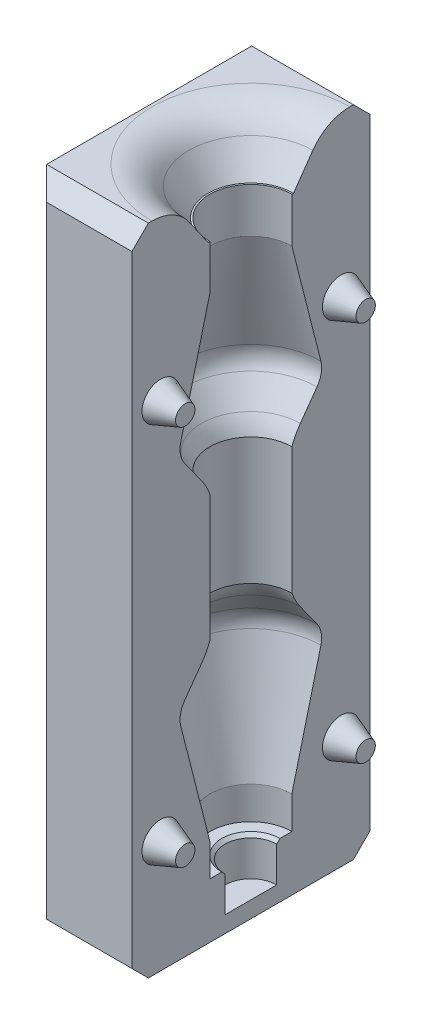
ISO-10303-21;
HEADER;
FILE_DESCRIPTION(('STEP AP214'),'2;1');
FILE_NAME('part.step','',(''),(''),'','','');
FILE_SCHEMA(('AUTOMOTIVE_DESIGN { 1 0 10303 214 1 1 1 1 }'));
ENDSEC;
DATA;
#1=APPLICATION_CONTEXT('core data for automotive mechanical design processes');
#2=APPLICATION_PROTOCOL_DEFINITION('international standard','automotive_design',2000,#1);
#3=PRODUCT_CONTEXT('',#1,'mechanical');
#4=PRODUCT('Part','Part','',(#3));
#5=PRODUCT_RELATED_PRODUCT_CATEGORY('part','',(#4));
#6=PRODUCT_DEFINITION_FORMATION('','',#4);
#7=PRODUCT_DEFINITION_CONTEXT('part definition',#1,'design');
#8=PRODUCT_DEFINITION('design','',#6,#7);
#9=PRODUCT_DEFINITION_SHAPE('','',#8);
#10=(LENGTH_UNIT() NAMED_UNIT(*) SI_UNIT(.MILLI.,.METRE.));
#11=(NAMED_UNIT(*) PLANE_ANGLE_UNIT() SI_UNIT($,.RADIAN.));
#12=(NAMED_UNIT(*) SI_UNIT($,.STERADIAN.) SOLID_ANGLE_UNIT());
#13=UNCERTAINTY_MEASURE_WITH_UNIT(LENGTH_MEASURE(1.E-05),#10,'distance_accuracy_value','');
#14=(GEOMETRIC_REPRESENTATION_CONTEXT(3) GLOBAL_UNCERTAINTY_ASSIGNED_CONTEXT((#13)) GLOBAL_UNIT_ASSIGNED_CONTEXT((#10,
#11,#12)) REPRESENTATION_CONTEXT('',''));
#15=CARTESIAN_POINT('',(0.,0.,0.));
#16=DIRECTION('',(0.,0.,1.));
#17=DIRECTION('',(1.,0.,0.));
#18=AXIS2_PLACEMENT_3D('',#15,#16,#17);
#19=CARTESIAN_POINT('',(15.,0.,0.));
#20=DIRECTION('',(-1.,0.,0.));
#21=DIRECTION('',(0.,0.,1.));
#22=AXIS2_PLACEMENT_3D('',#19,#20,#21);
#23=PLANE('',#22);
#24=CARTESIAN_POINT('',(15.,64.5,-4.));
#25=DIRECTION('',(-1.,0.,0.));
#26=DIRECTION('',(0.,0.,1.));
#27=AXIS2_PLACEMENT_3D('',#24,#25,#26);
#28=CIRCLE('',#27,2.275);
#29=CARTESIAN_POINT('',(15.,64.5,-1.725));
#30=VERTEX_POINT('',#29);
#31=EDGE_CURVE('E379',#30,#30,#28,.F.);
#32=ORIENTED_EDGE('',*,*,#31,.F.);
#33=EDGE_LOOP('',(#32));
#34=FACE_BOUND('',#33,.T.);
#35=CARTESIAN_POINT('',(15.,18.,-4.));
#36=DIRECTION('',(-1.,0.,0.));
#37=DIRECTION('',(0.,0.,1.));
#38=AXIS2_PLACEMENT_3D('',#35,#36,#37);
#39=CIRCLE('',#38,2.275);
#40=CARTESIAN_POINT('',(15.,18.,-1.725));
#41=VERTEX_POINT('',#40);
#42=EDGE_CURVE('E376',#41,#41,#39,.F.);
#43=ORIENTED_EDGE('',*,*,#42,.F.);
#44=EDGE_LOOP('',(#43));
#45=FACE_BOUND('',#44,.T.);
#46=CARTESIAN_POINT('',(15.,18.,-26.));
#47=DIRECTION('',(-1.,0.,0.));
#48=DIRECTION('',(0.,0.,1.));
#49=AXIS2_PLACEMENT_3D('',#46,#47,#48);
#50=CIRCLE('',#49,2.275);
#51=CARTESIAN_POINT('',(15.,18.,-23.725));
#52=VERTEX_POINT('',#51);
#53=EDGE_CURVE('E373',#52,#52,#50,.F.);
#54=ORIENTED_EDGE('',*,*,#53,.F.);
#55=EDGE_LOOP('',(#54));
#56=FACE_BOUND('',#55,.T.);
#57=CARTESIAN_POINT('',(15.,64.5,-26.));
#58=DIRECTION('',(-1.,0.,0.));
#59=DIRECTION('',(0.,0.,1.));
#60=AXIS2_PLACEMENT_3D('',#57,#58,#59);
#61=CIRCLE('',#60,2.275);
#62=CARTESIAN_POINT('',(15.,64.5,-23.725));
#63=VERTEX_POINT('',#62);
#64=EDGE_CURVE('E299',#63,#63,#61,.F.);
#65=ORIENTED_EDGE('',*,*,#64,.F.);
#66=EDGE_LOOP('',(#65));
#67=FACE_BOUND('',#66,.T.);
#68=DIRECTION('',(0.,0.,-1.));
#69=VECTOR('',#68,1.);
#70=CARTESIAN_POINT('',(15.,84.,0.));
#71=LINE('',#70,#69);
#72=CARTESIAN_POINT('',(15.,84.,-2.49999999999999));
#73=VERTEX_POINT('',#72);
#74=CARTESIAN_POINT('',(14.9999999999994,84.,-2.93688122196542));
#75=VERTEX_POINT('',#74);
#76=EDGE_CURVE('E301',#73,#75,#71,.T.);
#77=ORIENTED_EDGE('',*,*,#76,.F.);
#78=DIRECTION('',(0.,-0.707106781186544,0.707106781186551));
#79=VECTOR('',#78,1.);
#80=CARTESIAN_POINT('',(15.,84.,-2.49999999999999));
#81=LINE('',#80,#79);
#82=CARTESIAN_POINT('',(15.,82.,-0.5));
#83=VERTEX_POINT('',#82);
#84=EDGE_CURVE('E393',#73,#83,#81,.T.);
#85=ORIENTED_EDGE('',*,*,#84,.T.);
#86=DIRECTION('',(0.,1.,0.));
#87=VECTOR('',#86,1.);
#88=CARTESIAN_POINT('',(15.,0.,-0.5));
#89=LINE('',#88,#87);
#90=CARTESIAN_POINT('',(15.,6.28575422534891,-0.5));
#91=VERTEX_POINT('',#90);
#92=EDGE_CURVE('E248',#91,#83,#89,.T.);
#93=ORIENTED_EDGE('',*,*,#92,.F.);
#94=DIRECTION('',(0.,0.707106781186544,0.707106781186551));
#95=VECTOR('',#94,1.);
#96=CARTESIAN_POINT('',(15.,6.28575422534891,-0.5));
#97=LINE('',#96,#95);
#98=CARTESIAN_POINT('',(15.,4.28575422534894,-2.5));
#99=VERTEX_POINT('',#98);
#100=EDGE_CURVE('E391',#91,#99,#97,.F.);
#101=ORIENTED_EDGE('',*,*,#100,.T.);
#102=DIRECTION('',(0.,0.,-1.));
#103=VECTOR('',#102,1.);
#104=CARTESIAN_POINT('',(15.,4.28575422534894,0.));
#105=LINE('',#104,#103);
#106=CARTESIAN_POINT('',(15.,4.28575422534894,-27.5));
#107=VERTEX_POINT('',#106);
#108=EDGE_CURVE('E296',#99,#107,#105,.T.);
#109=ORIENTED_EDGE('',*,*,#108,.T.);
#110=DIRECTION('',(0.,0.707106781186544,-0.707106781186551));
#111=VECTOR('',#110,1.);
#112=CARTESIAN_POINT('',(15.,4.28575422534894,-27.5));
#113=LINE('',#112,#111);
#114=CARTESIAN_POINT('',(15.,6.28575422534891,-29.5));
#115=VERTEX_POINT('',#114);
#116=EDGE_CURVE('E389',#107,#115,#113,.T.);
#117=ORIENTED_EDGE('',*,*,#116,.T.);
#118=DIRECTION('',(0.,1.,0.));
#119=VECTOR('',#118,1.);
#120=CARTESIAN_POINT('',(15.,0.,-29.5));
#121=LINE('',#120,#119);
#122=CARTESIAN_POINT('',(15.,82.,-29.5));
#123=VERTEX_POINT('',#122);
#124=EDGE_CURVE('E242',#115,#123,#121,.T.);
#125=ORIENTED_EDGE('',*,*,#124,.T.);
#126=DIRECTION('',(0.,-0.707106781186544,-0.707106781186551));
#127=VECTOR('',#126,1.);
#128=CARTESIAN_POINT('',(15.,82.,-29.5));
#129=LINE('',#128,#127);
#130=CARTESIAN_POINT('',(15.,84.,-27.5));
#131=VERTEX_POINT('',#130);
#132=EDGE_CURVE('E387',#123,#131,#129,.F.);
#133=ORIENTED_EDGE('',*,*,#132,.T.);
#134=CARTESIAN_POINT('',(14.9999999999994,84.,-27.0631187780346));
#135=VERTEX_POINT('',#134);
#136=EDGE_CURVE('E304',#135,#131,#71,.T.);
#137=ORIENTED_EDGE('',*,*,#136,.F.);
#138=CARTESIAN_POINT('',(14.9999999999994,78.5,-27.0631187780346));
#139=DIRECTION('',(-1.,0.,0.));
#140=DIRECTION('',(0.,0.,1.));
#141=AXIS2_PLACEMENT_3D('',#138,#139,#140);
#142=CIRCLE('',#141,5.5);
#143=CARTESIAN_POINT('',(14.9999999999994,81.6546703999308,-22.5577825344452));
#144=VERTEX_POINT('',#143);
#145=EDGE_CURVE('E307',#135,#144,#142,.F.);
#146=ORIENTED_EDGE('',*,*,#145,.T.);
#147=DIRECTION('',(0.,-0.819152044288991,0.573576436351047));
#148=VECTOR('',#147,1.);
#149=CARTESIAN_POINT('',(15.,70.8610383379726,-15.));
#150=LINE('',#149,#148);
#151=CARTESIAN_POINT('',(15.,78.3,-20.2088170322047));
#152=VERTEX_POINT('',#151);
#153=EDGE_CURVE('E230',#152,#144,#150,.F.);
#154=ORIENTED_EDGE('',*,*,#153,.F.);
#155=DIRECTION('',(0.,0.,1.));
#156=VECTOR('',#155,1.);
#157=CARTESIAN_POINT('',(14.9999999999994,78.3,-15.));
#158=LINE('',#157,#156);
#159=CARTESIAN_POINT('',(14.9999999999994,78.3,-20.));
#160=VERTEX_POINT('',#159);
#161=EDGE_CURVE('E317',#152,#160,#158,.T.);
#162=ORIENTED_EDGE('',*,*,#161,.T.);
#163=DIRECTION('',(0.,1.,0.));
#164=VECTOR('',#163,1.);
#165=CARTESIAN_POINT('',(15.,0.,-20.));
#166=LINE('',#165,#164);
#167=CARTESIAN_POINT('',(15.,72.8279687630189,-20.));
#168=VERTEX_POINT('',#167);
#169=EDGE_CURVE('E318',#168,#160,#166,.T.);
#170=ORIENTED_EDGE('',*,*,#169,.F.);
#171=DIRECTION('',(0.,-0.969140628666556,-0.246508502627785));
#172=VECTOR('',#171,1.);
#173=CARTESIAN_POINT('',(15.,92.4853156361592,-15.));
#174=LINE('',#173,#172);
#175=CARTESIAN_POINT('',(15.,58.9056790871227,-23.5412433238688));
#176=VERTEX_POINT('',#175);
#177=EDGE_CURVE('E325',#176,#168,#174,.F.);
#178=ORIENTED_EDGE('',*,*,#177,.F.);
#179=CARTESIAN_POINT('',(15.,58.1661535792394,-20.6338214378691));
#180=DIRECTION('',(-1.,0.,0.));
#181=DIRECTION('',(0.,0.,1.));
#182=AXIS2_PLACEMENT_3D('',#179,#180,#181);
#183=CIRCLE('',#182,3.);
#184=CARTESIAN_POINT('',(15.,56.4142970331814,-23.06918560818));
#185=VERTEX_POINT('',#184);
#186=EDGE_CURVE('E329',#185,#176,#183,.F.);
#187=ORIENTED_EDGE('',*,*,#186,.F.);
#188=DIRECTION('',(0.,-0.811788056770281,0.583952182019325));
#189=VECTOR('',#188,1.);
#190=CARTESIAN_POINT('',(15.,45.1968228867001,-15.));
#191=LINE('',#190,#189);
#192=CARTESIAN_POINT('',(15.,53.5848299933968,-21.0338348315159));
#193=VERTEX_POINT('',#192);
#194=EDGE_CURVE('E333',#193,#185,#191,.F.);
#195=ORIENTED_EDGE('',*,*,#194,.F.);
#196=CARTESIAN_POINT('',(15.,48.8259067213079,-27.6495085019331));
#197=DIRECTION('',(-1.,0.,0.));
#198=DIRECTION('',(0.,0.,1.));
#199=AXIS2_PLACEMENT_3D('',#196,#197,#198);
#200=CIRCLE('',#199,8.1495085019331);
#201=CARTESIAN_POINT('',(15.,51.6365131508767,-20.));
#202=VERTEX_POINT('',#201);
#203=EDGE_CURVE('E341',#193,#202,#200,.F.);
#204=ORIENTED_EDGE('',*,*,#203,.T.);
#205=DIRECTION('',(0.,1.,0.));
#206=VECTOR('',#205,1.);
#207=CARTESIAN_POINT('',(15.,0.,-20.));
#208=LINE('',#207,#206);
#209=CARTESIAN_POINT('',(15.,36.1674950601248,-20.));
#210=VERTEX_POINT('',#209);
#211=EDGE_CURVE('E328',#210,#202,#208,.T.);
#212=ORIENTED_EDGE('',*,*,#211,.F.);
#213=CARTESIAN_POINT('',(15.,38.9781014896936,-27.6495085019331));
#214=DIRECTION('',(-1.,0.,0.));
#215=DIRECTION('',(0.,0.,1.));
#216=AXIS2_PLACEMENT_3D('',#213,#214,#215);
#217=CIRCLE('',#216,8.1495085019331);
#218=CARTESIAN_POINT('',(15.,34.2191782176047,-21.0338348315159));
#219=VERTEX_POINT('',#218);
#220=EDGE_CURVE('E344',#210,#219,#217,.F.);
#221=ORIENTED_EDGE('',*,*,#220,.T.);
#222=DIRECTION('',(0.,-0.811788056770281,-0.583952182019325));
#223=VECTOR('',#222,1.);
#224=CARTESIAN_POINT('',(15.,42.6071853243014,-15.));
#225=LINE('',#224,#223);
#226=CARTESIAN_POINT('',(15.,31.3897111778201,-23.06918560818));
#227=VERTEX_POINT('',#226);
#228=EDGE_CURVE('E354',#227,#219,#225,.F.);
#229=ORIENTED_EDGE('',*,*,#228,.F.);
#230=CARTESIAN_POINT('',(15.,29.6378546317621,-20.6338214378691));
#231=DIRECTION('',(-1.,0.,0.));
#232=DIRECTION('',(0.,0.,1.));
#233=AXIS2_PLACEMENT_3D('',#230,#231,#232);
#234=CIRCLE('',#233,3.);
#235=CARTESIAN_POINT('',(15.,28.8983291238788,-23.5412433238688));
#236=VERTEX_POINT('',#235);
#237=EDGE_CURVE('E359',#236,#227,#234,.F.);
#238=ORIENTED_EDGE('',*,*,#237,.F.);
#239=DIRECTION('',(0.,-0.969140628666556,0.246508502627785));
#240=VECTOR('',#239,1.);
#241=CARTESIAN_POINT('',(15.,-4.6813074251577,-15.));
#242=LINE('',#241,#240);
#243=CARTESIAN_POINT('',(15.,14.9760394479826,-20.));
#244=VERTEX_POINT('',#243);
#245=EDGE_CURVE('E356',#244,#236,#242,.F.);
#246=ORIENTED_EDGE('',*,*,#245,.F.);
#247=DIRECTION('',(0.,1.,0.));
#248=VECTOR('',#247,1.);
#249=CARTESIAN_POINT('',(15.,0.,-20.));
#250=LINE('',#249,#248);
#251=CARTESIAN_POINT('',(15.,11.,-20.));
#252=VERTEX_POINT('',#251);
#253=EDGE_CURVE('E303',#252,#244,#250,.T.);
#254=ORIENTED_EDGE('',*,*,#253,.F.);
#255=DIRECTION('',(0.,0.,-1.));
#256=VECTOR('',#255,1.);
#257=CARTESIAN_POINT('',(15.,11.,-15.));
#258=LINE('',#257,#256);
#259=CARTESIAN_POINT('',(15.,11.,-18.55));
#260=VERTEX_POINT('',#259);
#261=EDGE_CURVE('E314',#260,#252,#258,.T.);
#262=ORIENTED_EDGE('',*,*,#261,.F.);
#263=DIRECTION('',(0.,-0.707106781186544,0.707106781186551));
#264=VECTOR('',#263,1.);
#265=CARTESIAN_POINT('',(15.,7.45000000000003,-15.));
#266=LINE('',#265,#264);
#267=CARTESIAN_POINT('',(15.,10.6,-18.15));
#268=VERTEX_POINT('',#267);
#269=EDGE_CURVE('E367',#260,#268,#266,.T.);
#270=ORIENTED_EDGE('',*,*,#269,.T.);
#271=DIRECTION('',(0.,-1.,0.));
#272=VECTOR('',#271,1.);
#273=CARTESIAN_POINT('',(15.,11.,-18.15));
#274=LINE('',#273,#272);
#275=CARTESIAN_POINT('',(15.,6.28575422534894,-18.15));
#276=VERTEX_POINT('',#275);
#277=EDGE_CURVE('E226',#276,#268,#274,.F.);
#278=ORIENTED_EDGE('',*,*,#277,.F.);
#279=DIRECTION('',(0.,0.,-1.));
#280=VECTOR('',#279,1.);
#281=CARTESIAN_POINT('',(15.,6.28575422534894,0.));
#282=LINE('',#281,#280);
#283=CARTESIAN_POINT('',(15.,6.28575422534894,-11.85));
#284=VERTEX_POINT('',#283);
#285=EDGE_CURVE('E219',#284,#276,#282,.T.);
#286=ORIENTED_EDGE('',*,*,#285,.F.);
#287=DIRECTION('',(0.,-1.,0.));
#288=VECTOR('',#287,1.);
#289=CARTESIAN_POINT('',(15.,11.,-11.85));
#290=LINE('',#289,#288);
#291=CARTESIAN_POINT('',(15.,10.6,-11.85));
#292=VERTEX_POINT('',#291);
#293=EDGE_CURVE('E223',#292,#284,#290,.T.);
#294=ORIENTED_EDGE('',*,*,#293,.F.);
#295=DIRECTION('',(0.,0.707106781186544,0.707106781186551));
#296=VECTOR('',#295,1.);
#297=CARTESIAN_POINT('',(15.,7.45000000000003,-15.));
#298=LINE('',#297,#296);
#299=CARTESIAN_POINT('',(15.,11.,-11.45));
#300=VERTEX_POINT('',#299);
#301=EDGE_CURVE('E340',#292,#300,#298,.T.);
#302=ORIENTED_EDGE('',*,*,#301,.T.);
#303=CARTESIAN_POINT('',(15.,11.,-10.));
#304=VERTEX_POINT('',#303);
#305=EDGE_CURVE('E335',#304,#300,#258,.T.);
#306=ORIENTED_EDGE('',*,*,#305,.F.);
#307=DIRECTION('',(0.,1.,0.));
#308=VECTOR('',#307,1.);
#309=CARTESIAN_POINT('',(15.,0.,-10.));
#310=LINE('',#309,#308);
#311=CARTESIAN_POINT('',(15.,14.9760394479826,-10.));
#312=VERTEX_POINT('',#311);
#313=EDGE_CURVE('E238',#312,#304,#310,.F.);
#314=ORIENTED_EDGE('',*,*,#313,.F.);
#315=DIRECTION('',(0.,0.969140628666556,0.246508502627785));
#316=VECTOR('',#315,1.);
#317=CARTESIAN_POINT('',(15.,-4.6813074251577,-15.));
#318=LINE('',#317,#316);
#319=CARTESIAN_POINT('',(15.,28.8983291238788,-6.45875667613122));
#320=VERTEX_POINT('',#319);
#321=EDGE_CURVE('E360',#320,#312,#318,.F.);
#322=ORIENTED_EDGE('',*,*,#321,.F.);
#323=CARTESIAN_POINT('',(15.,29.6378546317621,-9.36617856213088));
#324=DIRECTION('',(-1.,0.,0.));
#325=DIRECTION('',(0.,0.,1.));
#326=AXIS2_PLACEMENT_3D('',#323,#324,#325);
#327=CIRCLE('',#326,3.);
#328=CARTESIAN_POINT('',(15.,31.3897111778201,-6.93081439182004));
#329=VERTEX_POINT('',#328);
#330=EDGE_CURVE('E357',#329,#320,#327,.F.);
#331=ORIENTED_EDGE('',*,*,#330,.F.);
#332=DIRECTION('',(0.,0.811788056770281,-0.583952182019325));
#333=VECTOR('',#332,1.);
#334=CARTESIAN_POINT('',(15.,42.6071853243014,-15.));
#335=LINE('',#334,#333);
#336=CARTESIAN_POINT('',(15.,34.2191782176047,-8.96616516848405));
#337=VERTEX_POINT('',#336);
#338=EDGE_CURVE('E348',#337,#329,#335,.F.);
#339=ORIENTED_EDGE('',*,*,#338,.F.);
#340=CARTESIAN_POINT('',(15.,38.9781014896936,-2.3504914980669));
#341=DIRECTION('',(-1.,0.,0.));
#342=DIRECTION('',(0.,0.,1.));
#343=AXIS2_PLACEMENT_3D('',#340,#341,#342);
#344=CIRCLE('',#343,8.1495085019331);
#345=CARTESIAN_POINT('',(15.,36.1674950601248,-10.));
#346=VERTEX_POINT('',#345);
#347=EDGE_CURVE('E322',#337,#346,#344,.F.);
#348=ORIENTED_EDGE('',*,*,#347,.T.);
#349=DIRECTION('',(0.,1.,0.));
#350=VECTOR('',#349,1.);
#351=CARTESIAN_POINT('',(15.,0.,-10.));
#352=LINE('',#351,#350);
#353=CARTESIAN_POINT('',(15.,51.6365131508767,-10.));
#354=VERTEX_POINT('',#353);
#355=EDGE_CURVE('E346',#354,#346,#352,.F.);
#356=ORIENTED_EDGE('',*,*,#355,.F.);
#357=CARTESIAN_POINT('',(15.,48.8259067213079,-2.3504914980669));
#358=DIRECTION('',(-1.,0.,0.));
#359=DIRECTION('',(0.,0.,1.));
#360=AXIS2_PLACEMENT_3D('',#357,#358,#359);
#361=CIRCLE('',#360,8.1495085019331);
#362=CARTESIAN_POINT('',(15.,53.5848299933968,-8.96616516848405));
#363=VERTEX_POINT('',#362);
#364=EDGE_CURVE('E337',#354,#363,#361,.F.);
#365=ORIENTED_EDGE('',*,*,#364,.T.);
#366=DIRECTION('',(0.,0.811788056770281,0.583952182019325));
#367=VECTOR('',#366,1.);
#368=CARTESIAN_POINT('',(15.,45.1968228867001,-15.));
#369=LINE('',#368,#367);
#370=CARTESIAN_POINT('',(15.,56.4142970331814,-6.93081439182004));
#371=VERTEX_POINT('',#370);
#372=EDGE_CURVE('E331',#371,#363,#369,.F.);
#373=ORIENTED_EDGE('',*,*,#372,.F.);
#374=CARTESIAN_POINT('',(15.,58.1661535792394,-9.36617856213088));
#375=DIRECTION('',(-1.,0.,0.));
#376=DIRECTION('',(0.,0.,1.));
#377=AXIS2_PLACEMENT_3D('',#374,#375,#376);
#378=CIRCLE('',#377,3.);
#379=CARTESIAN_POINT('',(15.,58.9056790871227,-6.45875667613122));
#380=VERTEX_POINT('',#379);
#381=EDGE_CURVE('E326',#380,#371,#378,.F.);
#382=ORIENTED_EDGE('',*,*,#381,.F.);
#383=DIRECTION('',(0.,0.969140628666556,-0.246508502627785));
#384=VECTOR('',#383,1.);
#385=CARTESIAN_POINT('',(15.,92.4853156361592,-15.));
#386=LINE('',#385,#384);
#387=CARTESIAN_POINT('',(15.,72.8279687630189,-10.));
#388=VERTEX_POINT('',#387);
#389=EDGE_CURVE('E323',#388,#380,#386,.F.);
#390=ORIENTED_EDGE('',*,*,#389,.F.);
#391=DIRECTION('',(0.,1.,0.));
#392=VECTOR('',#391,1.);
#393=CARTESIAN_POINT('',(15.,0.,-10.));
#394=LINE('',#393,#392);
#395=CARTESIAN_POINT('',(14.9999999999994,78.3,-10.));
#396=VERTEX_POINT('',#395);
#397=EDGE_CURVE('E320',#396,#388,#394,.F.);
#398=ORIENTED_EDGE('',*,*,#397,.F.);
#399=CARTESIAN_POINT('',(14.9999999999994,78.3,-9.79118296779536));
#400=VERTEX_POINT('',#399);
#401=EDGE_CURVE('E310',#396,#400,#158,.T.);
#402=ORIENTED_EDGE('',*,*,#401,.T.);
#403=DIRECTION('',(0.,0.819152044288991,0.573576436351047));
#404=VECTOR('',#403,1.);
#405=CARTESIAN_POINT('',(15.,70.8610383379726,-15.));
#406=LINE('',#405,#404);
#407=CARTESIAN_POINT('',(14.9999999999994,81.6546703999308,-7.44221746555486));
#408=VERTEX_POINT('',#407);
#409=EDGE_CURVE('E312',#408,#400,#406,.F.);
#410=ORIENTED_EDGE('',*,*,#409,.F.);
#411=CARTESIAN_POINT('',(14.9999999999994,78.5,-2.93688122196542));
#412=DIRECTION('',(-1.,0.,0.));
#413=DIRECTION('',(0.,0.,1.));
#414=AXIS2_PLACEMENT_3D('',#411,#412,#413);
#415=CIRCLE('',#414,5.5);
#416=EDGE_CURVE('E300',#408,#75,#415,.F.);
#417=ORIENTED_EDGE('',*,*,#416,.T.);
#418=EDGE_LOOP('',(#77,#85,#93,#101,#109,#117,#125,#133,#137,#146,#154,#162,#170,#178,#187,#195,
#204,#212,#221,#229,#238,#246,#254,#262,#270,#278,#286,#294,#302,#306,#314,#322,#331,#339,#348,
#356,#365,#373,#382,#390,#398,#402,#410,#417));
#419=FACE_BOUND('',#418,.T.);
#420=ADVANCED_FACE('F41',(#34,#45,#56,#67,#419),#23,.F.);
#421=CARTESIAN_POINT('',(15.,0.,-15.));
#422=DIRECTION('',(0.,1.,0.));
#423=DIRECTION('',(0.,0.,1.));
#424=AXIS2_PLACEMENT_3D('',#421,#422,#423);
#425=CYLINDRICAL_SURFACE('',#424,5.);
#426=CARTESIAN_POINT('',(15.,78.3,-15.));
#427=DIRECTION('',(0.,1.,0.));
#428=DIRECTION('',(0.,0.,1.));
#429=AXIS2_PLACEMENT_3D('',#426,#427,#428);
#430=CIRCLE('',#429,5.);
#431=EDGE_CURVE('E245',#396,#160,#430,.F.);
#432=ORIENTED_EDGE('',*,*,#431,.F.);
#433=ORIENTED_EDGE('',*,*,#397,.T.);
#434=CARTESIAN_POINT('',(15.,72.8279687630189,-15.));
#435=DIRECTION('',(0.,-1.,0.));
#436=DIRECTION('',(0.,0.,-1.));
#437=AXIS2_PLACEMENT_3D('',#434,#435,#436);
#438=CIRCLE('',#437,5.);
#439=EDGE_CURVE('E276',#388,#168,#438,.T.);
#440=ORIENTED_EDGE('',*,*,#439,.T.);
#441=ORIENTED_EDGE('',*,*,#169,.T.);
#442=EDGE_LOOP('',(#432,#433,#440,#441));
#443=FACE_BOUND('',#442,.T.);
#444=ADVANCED_FACE('F518',(#443),#425,.F.);
#445=CARTESIAN_POINT('',(15.,11.,-15.));
#446=DIRECTION('',(0.,-1.,0.));
#447=DIRECTION('',(0.,0.,-1.));
#448=AXIS2_PLACEMENT_3D('',#445,#446,#447);
#449=CYLINDRICAL_SURFACE('',#448,3.15);
#450=CARTESIAN_POINT('',(15.,6.28575422534894,-15.));
#451=DIRECTION('',(0.,1.,0.));
#452=DIRECTION('',(0.,0.,1.));
#453=AXIS2_PLACEMENT_3D('',#450,#451,#452);
#454=CIRCLE('',#453,3.15);
#455=EDGE_CURVE('E235',#284,#276,#454,.F.);
#456=ORIENTED_EDGE('',*,*,#455,.T.);
#457=ORIENTED_EDGE('',*,*,#277,.T.);
#458=CARTESIAN_POINT('',(15.,10.6,-15.));
#459=DIRECTION('',(0.,-1.,0.));
#460=DIRECTION('',(0.,0.,-1.));
#461=AXIS2_PLACEMENT_3D('',#458,#459,#460);
#462=CIRCLE('',#461,3.15);
#463=EDGE_CURVE('E237',#268,#292,#462,.F.);
#464=ORIENTED_EDGE('',*,*,#463,.T.);
#465=ORIENTED_EDGE('',*,*,#293,.T.);
#466=EDGE_LOOP('',(#456,#457,#464,#465));
#467=FACE_BOUND('',#466,.T.);
#468=ADVANCED_FACE('F234',(#467),#449,.F.);
#469=CARTESIAN_POINT('',(15.,14.9760394479826,-15.));
#470=DIRECTION('',(0.,1.,0.));
#471=DIRECTION('',(0.,0.,1.));
#472=AXIS2_PLACEMENT_3D('',#469,#470,#471);
#473=CIRCLE('',#472,5.);
#474=EDGE_CURVE('E270',#244,#312,#473,.T.);
#475=ORIENTED_EDGE('',*,*,#474,.T.);
#476=ORIENTED_EDGE('',*,*,#313,.T.);
#477=CARTESIAN_POINT('',(15.,11.,-15.));
#478=DIRECTION('',(0.,-1.,0.));
#479=DIRECTION('',(0.,0.,-1.));
#480=AXIS2_PLACEMENT_3D('',#477,#478,#479);
#481=CIRCLE('',#480,5.);
#482=EDGE_CURVE('E282',#252,#304,#481,.F.);
#483=ORIENTED_EDGE('',*,*,#482,.F.);
#484=ORIENTED_EDGE('',*,*,#253,.T.);
#485=EDGE_LOOP('',(#475,#476,#483,#484));
#486=FACE_BOUND('',#485,.T.);
#487=ADVANCED_FACE('F566',(#486),#425,.F.);
#488=CARTESIAN_POINT('',(0.,84.,0.));
#489=DIRECTION('',(0.,-1.,0.));
#490=DIRECTION('',(0.,0.,-1.));
#491=AXIS2_PLACEMENT_3D('',#488,#489,#490);
#492=PLANE('',#491);
#493=DIRECTION('',(0.,0.,1.));
#494=VECTOR('',#493,1.);
#495=CARTESIAN_POINT('',(2.6,84.,0.));
#496=LINE('',#495,#494);
#497=CARTESIAN_POINT('',(2.6,84.,-27.5));
#498=VERTEX_POINT('',#497);
#499=CARTESIAN_POINT('',(2.6,84.,-2.49999999999997));
#500=VERTEX_POINT('',#499);
#501=EDGE_CURVE('E457',#498,#500,#496,.T.);
#502=ORIENTED_EDGE('',*,*,#501,.T.);
#503=DIRECTION('',(1.,0.,0.));
#504=VECTOR('',#503,1.);
#505=CARTESIAN_POINT('',(15.,84.,-2.49999999999999));
#506=LINE('',#505,#504);
#507=EDGE_CURVE('E384',#500,#73,#506,.T.);
#508=ORIENTED_EDGE('',*,*,#507,.T.);
#509=ORIENTED_EDGE('',*,*,#76,.T.);
#510=CARTESIAN_POINT('',(14.9999999999994,84.,-15.));
#511=DIRECTION('',(0.,-1.,0.));
#512=DIRECTION('',(0.,0.,-1.));
#513=AXIS2_PLACEMENT_3D('',#510,#511,#512);
#514=CIRCLE('',#513,12.0631187780346);
#515=EDGE_CURVE('E231',#75,#135,#514,.T.);
#516=ORIENTED_EDGE('',*,*,#515,.T.);
#517=ORIENTED_EDGE('',*,*,#136,.T.);
#518=DIRECTION('',(-1.,0.,0.));
#519=VECTOR('',#518,1.);
#520=CARTESIAN_POINT('',(0.,84.,-27.5));
#521=LINE('',#520,#519);
#522=EDGE_CURVE('E382',#131,#498,#521,.T.);
#523=ORIENTED_EDGE('',*,*,#522,.T.);
#524=EDGE_LOOP('',(#502,#508,#509,#516,#517,#523));
#525=FACE_BOUND('',#524,.T.);
#526=ADVANCED_FACE('F500',(#525),#492,.F.);
#527=CARTESIAN_POINT('',(15.,29.6378546317621,-15.));
#528=DIRECTION('',(0.,-1.,0.));
#529=DIRECTION('',(0.,0.,1.));
#530=AXIS2_PLACEMENT_3D('',#527,#528,#529);
#531=TOROIDAL_SURFACE('',#530,5.63382143786911,3.);
#532=CARTESIAN_POINT('',(15.,28.8983291238788,-15.));
#533=DIRECTION('',(0.,1.,0.));
#534=DIRECTION('',(0.,0.,1.));
#535=AXIS2_PLACEMENT_3D('',#532,#533,#534);
#536=CIRCLE('',#535,8.54124332386878);
#537=EDGE_CURVE('E255',#236,#320,#536,.T.);
#538=ORIENTED_EDGE('',*,*,#537,.F.);
#539=ORIENTED_EDGE('',*,*,#237,.T.);
#540=CARTESIAN_POINT('',(15.,31.3897111778201,-15.));
#541=DIRECTION('',(0.,-1.,0.));
#542=DIRECTION('',(0.,0.,-1.));
#543=AXIS2_PLACEMENT_3D('',#540,#541,#542);
#544=CIRCLE('',#543,8.06918560817996);
#545=EDGE_CURVE('E252',#329,#227,#544,.T.);
#546=ORIENTED_EDGE('',*,*,#545,.F.);
#547=ORIENTED_EDGE('',*,*,#330,.T.);
#548=EDGE_LOOP('',(#538,#539,#546,#547));
#549=FACE_BOUND('',#548,.T.);
#550=ADVANCED_FACE('F556',(#549),#531,.F.);
#551=CARTESIAN_POINT('',(15.,34.4020041055008,-15.));
#552=DIRECTION('',(0.,1.,0.));
#553=DIRECTION('',(0.,0.,-1.));
#554=AXIS2_PLACEMENT_3D('',#551,#552,#553);
#555=CONICAL_SURFACE('',#554,9.94114612284268,0.249075921515313);
#556=ORIENTED_EDGE('',*,*,#537,.T.);
#557=ORIENTED_EDGE('',*,*,#321,.T.);
#558=ORIENTED_EDGE('',*,*,#474,.F.);
#559=ORIENTED_EDGE('',*,*,#245,.T.);
#560=EDGE_LOOP('',(#556,#557,#558,#559));
#561=FACE_BOUND('',#560,.T.);
#562=ADVANCED_FACE('F559',(#561),#555,.F.);
#563=CARTESIAN_POINT('',(15.,34.4020041055008,-15.));
#564=DIRECTION('',(0.,-1.,0.));
#565=DIRECTION('',(0.,0.,1.));
#566=AXIS2_PLACEMENT_3D('',#563,#564,#565);
#567=CONICAL_SURFACE('',#566,5.90232073091279,0.623588704481849);
#568=ORIENTED_EDGE('',*,*,#545,.T.);
#569=ORIENTED_EDGE('',*,*,#228,.T.);
#570=CARTESIAN_POINT('',(15.,34.2191782176047,-15.));
#571=DIRECTION('',(0.,-1.,0.));
#572=DIRECTION('',(0.,0.,-1.));
#573=AXIS2_PLACEMENT_3D('',#570,#571,#572);
#574=CIRCLE('',#573,6.03383483151595);
#575=EDGE_CURVE('E258',#219,#337,#574,.F.);
#576=ORIENTED_EDGE('',*,*,#575,.T.);
#577=ORIENTED_EDGE('',*,*,#338,.T.);
#578=EDGE_LOOP('',(#568,#569,#576,#577));
#579=FACE_BOUND('',#578,.T.);
#580=ADVANCED_FACE('F553',(#579),#567,.F.);
#581=CARTESIAN_POINT('',(15.,38.9781014896936,-15.));
#582=DIRECTION('',(0.,1.,0.));
#583=DIRECTION('',(0.,0.,-1.));
#584=AXIS2_PLACEMENT_3D('',#581,#582,#583);
#585=TOROIDAL_SURFACE('',#584,12.6495085019331,8.1495085019331);
#586=ORIENTED_EDGE('',*,*,#347,.F.);
#587=ORIENTED_EDGE('',*,*,#575,.F.);
#588=ORIENTED_EDGE('',*,*,#220,.F.);
#589=CARTESIAN_POINT('',(15.,36.1674950601248,-15.));
#590=DIRECTION('',(0.,1.,0.));
#591=DIRECTION('',(0.,0.,1.));
#592=AXIS2_PLACEMENT_3D('',#589,#590,#591);
#593=CIRCLE('',#592,5.);
#594=EDGE_CURVE('E273',#210,#346,#593,.T.);
#595=ORIENTED_EDGE('',*,*,#594,.T.);
#596=EDGE_LOOP('',(#586,#587,#588,#595));
#597=FACE_BOUND('',#596,.T.);
#598=ADVANCED_FACE('F544',(#597),#585,.T.);
#599=CARTESIAN_POINT('',(15.,51.6365131508767,-15.));
#600=DIRECTION('',(0.,-1.,0.));
#601=DIRECTION('',(0.,0.,-1.));
#602=AXIS2_PLACEMENT_3D('',#599,#600,#601);
#603=CIRCLE('',#602,5.);
#604=EDGE_CURVE('E279',#354,#202,#603,.T.);
#605=ORIENTED_EDGE('',*,*,#604,.F.);
#606=ORIENTED_EDGE('',*,*,#355,.T.);
#607=ORIENTED_EDGE('',*,*,#594,.F.);
#608=ORIENTED_EDGE('',*,*,#211,.T.);
#609=EDGE_LOOP('',(#605,#606,#607,#608));
#610=FACE_BOUND('',#609,.T.);
#611=ADVANCED_FACE('F542',(#610),#425,.F.);
#612=CARTESIAN_POINT('',(15.,48.8259067213079,-15.));
#613=DIRECTION('',(0.,-1.,0.));
#614=DIRECTION('',(0.,0.,-1.));
#615=AXIS2_PLACEMENT_3D('',#612,#613,#614);
#616=TOROIDAL_SURFACE('',#615,12.6495085019331,8.1495085019331);
#617=ORIENTED_EDGE('',*,*,#203,.F.);
#618=CARTESIAN_POINT('',(15.,53.5848299933968,-15.));
#619=DIRECTION('',(0.,-1.,0.));
#620=DIRECTION('',(0.,0.,-1.));
#621=AXIS2_PLACEMENT_3D('',#618,#619,#620);
#622=CIRCLE('',#621,6.03383483151595);
#623=EDGE_CURVE('E267',#193,#363,#622,.F.);
#624=ORIENTED_EDGE('',*,*,#623,.T.);
#625=ORIENTED_EDGE('',*,*,#364,.F.);
#626=ORIENTED_EDGE('',*,*,#604,.T.);
#627=EDGE_LOOP('',(#617,#624,#625,#626));
#628=FACE_BOUND('',#627,.T.);
#629=ADVANCED_FACE('F539',(#628),#616,.T.);
#630=CARTESIAN_POINT('',(15.,53.4020041055008,-15.));
#631=DIRECTION('',(0.,-1.,0.));
#632=DIRECTION('',(0.,0.,-1.));
#633=AXIS2_PLACEMENT_3D('',#630,#631,#632);
#634=CONICAL_SURFACE('',#633,9.94114612284268,0.249075921515313);
#635=CARTESIAN_POINT('',(15.,58.9056790871227,-15.));
#636=DIRECTION('',(0.,1.,0.));
#637=DIRECTION('',(0.,0.,1.));
#638=AXIS2_PLACEMENT_3D('',#635,#636,#637);
#639=CIRCLE('',#638,8.54124332386878);
#640=EDGE_CURVE('E264',#176,#380,#639,.T.);
#641=ORIENTED_EDGE('',*,*,#640,.F.);
#642=ORIENTED_EDGE('',*,*,#177,.T.);
#643=ORIENTED_EDGE('',*,*,#439,.F.);
#644=ORIENTED_EDGE('',*,*,#389,.T.);
#645=EDGE_LOOP('',(#641,#642,#643,#644));
#646=FACE_BOUND('',#645,.T.);
#647=ADVANCED_FACE('F526',(#646),#634,.F.);
#648=CARTESIAN_POINT('',(15.,58.1661535792394,-15.));
#649=DIRECTION('',(0.,1.,0.));
#650=DIRECTION('',(0.,0.,1.));
#651=AXIS2_PLACEMENT_3D('',#648,#649,#650);
#652=TOROIDAL_SURFACE('',#651,5.63382143786911,3.);
#653=ORIENTED_EDGE('',*,*,#640,.T.);
#654=ORIENTED_EDGE('',*,*,#381,.T.);
#655=CARTESIAN_POINT('',(15.,56.4142970331814,-15.));
#656=DIRECTION('',(0.,-1.,0.));
#657=DIRECTION('',(0.,0.,-1.));
#658=AXIS2_PLACEMENT_3D('',#655,#656,#657);
#659=CIRCLE('',#658,8.06918560817996);
#660=EDGE_CURVE('E261',#371,#185,#659,.T.);
#661=ORIENTED_EDGE('',*,*,#660,.T.);
#662=ORIENTED_EDGE('',*,*,#186,.T.);
#663=EDGE_LOOP('',(#653,#654,#661,#662));
#664=FACE_BOUND('',#663,.T.);
#665=ADVANCED_FACE('F529',(#664),#652,.F.);
#666=CARTESIAN_POINT('',(15.,53.4020041055008,-15.));
#667=DIRECTION('',(0.,1.,0.));
#668=DIRECTION('',(0.,0.,1.));
#669=AXIS2_PLACEMENT_3D('',#666,#667,#668);
#670=CONICAL_SURFACE('',#669,5.90232073091279,0.623588704481849);
#671=ORIENTED_EDGE('',*,*,#660,.F.);
#672=ORIENTED_EDGE('',*,*,#372,.T.);
#673=ORIENTED_EDGE('',*,*,#623,.F.);
#674=ORIENTED_EDGE('',*,*,#194,.T.);
#675=EDGE_LOOP('',(#671,#672,#673,#674));
#676=FACE_BOUND('',#675,.T.);
#677=ADVANCED_FACE('F533',(#676),#670,.F.);
#678=CARTESIAN_POINT('',(15.,11.,-15.));
#679=DIRECTION('',(0.,-1.,0.));
#680=DIRECTION('',(0.,0.,-1.));
#681=AXIS2_PLACEMENT_3D('',#678,#679,#680);
#682=PLANE('',#681);
#683=ORIENTED_EDGE('',*,*,#482,.T.);
#684=ORIENTED_EDGE('',*,*,#305,.T.);
#685=CARTESIAN_POINT('',(15.,11.,-15.));
#686=DIRECTION('',(0.,-1.,0.));
#687=DIRECTION('',(0.,0.,-1.));
#688=AXIS2_PLACEMENT_3D('',#685,#686,#687);
#689=CIRCLE('',#688,3.55000000000001);
#690=EDGE_CURVE('E286',#300,#260,#689,.T.);
#691=ORIENTED_EDGE('',*,*,#690,.T.);
#692=ORIENTED_EDGE('',*,*,#261,.T.);
#693=EDGE_LOOP('',(#683,#684,#691,#692));
#694=FACE_BOUND('',#693,.T.);
#695=ADVANCED_FACE('F569',(#694),#682,.F.);
#696=CARTESIAN_POINT('',(15.,11.,-15.));
#697=DIRECTION('',(0.,1.,0.));
#698=DIRECTION('',(0.,0.,1.));
#699=AXIS2_PLACEMENT_3D('',#696,#697,#698);
#700=CONICAL_SURFACE('',#699,3.55000000000001,0.785398163397454);
#701=ORIENTED_EDGE('',*,*,#301,.F.);
#702=ORIENTED_EDGE('',*,*,#463,.F.);
#703=ORIENTED_EDGE('',*,*,#269,.F.);
#704=ORIENTED_EDGE('',*,*,#690,.F.);
#705=EDGE_LOOP('',(#701,#702,#703,#704));
#706=FACE_BOUND('',#705,.T.);
#707=ADVANCED_FACE('F572',(#706),#700,.F.);
#708=CARTESIAN_POINT('',(14.9999999999994,78.3,-15.));
#709=DIRECTION('',(0.,1.,0.));
#710=DIRECTION('',(0.,0.,1.));
#711=AXIS2_PLACEMENT_3D('',#708,#709,#710);
#712=PLANE('',#711);
#713=ORIENTED_EDGE('',*,*,#161,.F.);
#714=CARTESIAN_POINT('',(14.9999999999994,78.3,-15.));
#715=DIRECTION('',(0.,1.,0.));
#716=DIRECTION('',(0.,0.,1.));
#717=AXIS2_PLACEMENT_3D('',#714,#715,#716);
#718=CIRCLE('',#717,5.20881703220465);
#719=EDGE_CURVE('E241',#152,#400,#718,.T.);
#720=ORIENTED_EDGE('',*,*,#719,.T.);
#721=ORIENTED_EDGE('',*,*,#401,.F.);
#722=ORIENTED_EDGE('',*,*,#431,.T.);
#723=EDGE_LOOP('',(#713,#720,#721,#722));
#724=FACE_BOUND('',#723,.T.);
#725=ADVANCED_FACE('F514',(#724),#712,.T.);
#726=CARTESIAN_POINT('',(14.9999999999994,84.,-15.));
#727=DIRECTION('',(0.,1.,0.));
#728=DIRECTION('',(0.,0.,1.));
#729=AXIS2_PLACEMENT_3D('',#726,#727,#728);
#730=CONICAL_SURFACE('',#729,9.2,0.610865238198017);
#731=CARTESIAN_POINT('',(14.9999999999994,81.6546703999308,-15.));
#732=DIRECTION('',(0.,-1.,0.));
#733=DIRECTION('',(0.,0.,-1.));
#734=AXIS2_PLACEMENT_3D('',#731,#732,#733);
#735=CIRCLE('',#734,7.55778253444515);
#736=EDGE_CURVE('E289',#144,#408,#735,.F.);
#737=ORIENTED_EDGE('',*,*,#736,.T.);
#738=ORIENTED_EDGE('',*,*,#409,.T.);
#739=ORIENTED_EDGE('',*,*,#719,.F.);
#740=ORIENTED_EDGE('',*,*,#153,.T.);
#741=EDGE_LOOP('',(#737,#738,#739,#740));
#742=FACE_BOUND('',#741,.T.);
#743=ADVANCED_FACE('F512',(#742),#730,.F.);
#744=CARTESIAN_POINT('',(14.9999999999994,78.5,-15.));
#745=DIRECTION('',(0.,-1.,0.));
#746=DIRECTION('',(0.,0.,-1.));
#747=AXIS2_PLACEMENT_3D('',#744,#745,#746);
#748=TOROIDAL_SURFACE('',#747,12.0631187780346,5.5);
#749=ORIENTED_EDGE('',*,*,#145,.F.);
#750=ORIENTED_EDGE('',*,*,#515,.F.);
#751=ORIENTED_EDGE('',*,*,#416,.F.);
#752=ORIENTED_EDGE('',*,*,#736,.F.);
#753=EDGE_LOOP('',(#749,#750,#751,#752));
#754=FACE_BOUND('',#753,.T.);
#755=ADVANCED_FACE('F504',(#754),#748,.T.);
#756=CARTESIAN_POINT('',(0.,6.28575422534894,0.));
#757=DIRECTION('',(0.,-1.,0.));
#758=DIRECTION('',(0.,0.,-1.));
#759=AXIS2_PLACEMENT_3D('',#756,#757,#758);
#760=PLANE('',#759);
#761=ORIENTED_EDGE('',*,*,#455,.F.);
#762=ORIENTED_EDGE('',*,*,#285,.T.);
#763=EDGE_LOOP('',(#761,#762));
#764=FACE_BOUND('',#763,.T.);
#765=ADVANCED_FACE('F240',(#764),#760,.F.);
#766=CARTESIAN_POINT('',(0.,4.28575422534894,0.));
#767=DIRECTION('',(0.,-1.,0.));
#768=DIRECTION('',(0.,0.,-1.));
#769=AXIS2_PLACEMENT_3D('',#766,#767,#768);
#770=PLANE('',#769);
#771=ORIENTED_EDGE('',*,*,#108,.F.);
#772=DIRECTION('',(-1.,0.,0.));
#773=VECTOR('',#772,1.);
#774=CARTESIAN_POINT('',(0.,4.28575422534894,-2.5));
#775=LINE('',#774,#773);
#776=CARTESIAN_POINT('',(4.6,4.28575422534894,-2.5));
#777=VERTEX_POINT('',#776);
#778=EDGE_CURVE('E411',#99,#777,#775,.T.);
#779=ORIENTED_EDGE('',*,*,#778,.T.);
#780=DIRECTION('',(0.,0.,-1.));
#781=VECTOR('',#780,1.);
#782=CARTESIAN_POINT('',(4.6,4.28575422534894,0.));
#783=LINE('',#782,#781);
#784=CARTESIAN_POINT('',(4.59999999999999,4.28575422534894,-27.5));
#785=VERTEX_POINT('',#784);
#786=EDGE_CURVE('E409',#777,#785,#783,.T.);
#787=ORIENTED_EDGE('',*,*,#786,.T.);
#788=DIRECTION('',(1.,0.,0.));
#789=VECTOR('',#788,1.);
#790=CARTESIAN_POINT('',(15.,4.28575422534894,-27.5));
#791=LINE('',#790,#789);
#792=EDGE_CURVE('E407',#785,#107,#791,.T.);
#793=ORIENTED_EDGE('',*,*,#792,.T.);
#794=EDGE_LOOP('',(#771,#779,#787,#793));
#795=FACE_BOUND('',#794,.T.);
#796=ADVANCED_FACE('F489',(#795),#770,.T.);
#797=CARTESIAN_POINT('',(0.,4.28575422534894,-29.5));
#798=DIRECTION('',(0.,0.,1.));
#799=DIRECTION('',(1.,0.,0.));
#800=AXIS2_PLACEMENT_3D('',#797,#798,#799);
#801=PLANE('',#800);
#802=ORIENTED_EDGE('',*,*,#124,.F.);
#803=DIRECTION('',(-1.,0.,0.));
#804=VECTOR('',#803,1.);
#805=CARTESIAN_POINT('',(2.6,6.28575422534891,-29.5));
#806=LINE('',#805,#804);
#807=CARTESIAN_POINT('',(4.59999999999997,6.28575422534891,-29.5));
#808=VERTEX_POINT('',#807);
#809=EDGE_CURVE('E11',#115,#808,#806,.T.);
#810=ORIENTED_EDGE('',*,*,#809,.T.);
#811=DIRECTION('',(0.,1.,0.));
#812=VECTOR('',#811,1.);
#813=CARTESIAN_POINT('',(4.59999999999997,84.,-29.5));
#814=LINE('',#813,#812);
#815=CARTESIAN_POINT('',(4.59999999999997,82.,-29.5));
#816=VERTEX_POINT('',#815);
#817=EDGE_CURVE('E51',#808,#816,#814,.T.);
#818=ORIENTED_EDGE('',*,*,#817,.T.);
#819=DIRECTION('',(1.,0.,0.));
#820=VECTOR('',#819,1.);
#821=CARTESIAN_POINT('',(0.,82.,-29.5));
#822=LINE('',#821,#820);
#823=EDGE_CURVE('E413',#816,#123,#822,.T.);
#824=ORIENTED_EDGE('',*,*,#823,.T.);
#825=EDGE_LOOP('',(#802,#810,#818,#824));
#826=FACE_BOUND('',#825,.T.);
#827=ADVANCED_FACE('F494',(#826),#801,.F.);
#828=CARTESIAN_POINT('',(0.,4.28575422534894,-0.5));
#829=DIRECTION('',(0.,0.,1.));
#830=DIRECTION('',(1.,0.,0.));
#831=AXIS2_PLACEMENT_3D('',#828,#829,#830);
#832=PLANE('',#831);
#833=ORIENTED_EDGE('',*,*,#92,.T.);
#834=DIRECTION('',(-1.,0.,0.));
#835=VECTOR('',#834,1.);
#836=CARTESIAN_POINT('',(2.6,82.,-0.5));
#837=LINE('',#836,#835);
#838=CARTESIAN_POINT('',(4.6,82.,-0.5));
#839=VERTEX_POINT('',#838);
#840=EDGE_CURVE('E399',#83,#839,#837,.T.);
#841=ORIENTED_EDGE('',*,*,#840,.T.);
#842=DIRECTION('',(0.,-1.,0.));
#843=VECTOR('',#842,1.);
#844=CARTESIAN_POINT('',(4.6,4.28575422534894,-0.5));
#845=LINE('',#844,#843);
#846=CARTESIAN_POINT('',(4.6,6.28575422534891,-0.5));
#847=VERTEX_POINT('',#846);
#848=EDGE_CURVE('E397',#839,#847,#845,.T.);
#849=ORIENTED_EDGE('',*,*,#848,.T.);
#850=DIRECTION('',(1.,0.,0.));
#851=VECTOR('',#850,1.);
#852=CARTESIAN_POINT('',(0.,6.28575422534891,-0.5));
#853=LINE('',#852,#851);
#854=EDGE_CURVE('E395',#847,#91,#853,.T.);
#855=ORIENTED_EDGE('',*,*,#854,.T.);
#856=EDGE_LOOP('',(#833,#841,#849,#855));
#857=FACE_BOUND('',#856,.T.);
#858=ADVANCED_FACE('F463',(#857),#832,.T.);
#859=CARTESIAN_POINT('',(2.6,4.28575422534894,0.));
#860=DIRECTION('',(-1.,0.,0.));
#861=DIRECTION('',(0.,0.,1.));
#862=AXIS2_PLACEMENT_3D('',#859,#860,#861);
#863=PLANE('',#862);
#864=DIRECTION('',(0.,0.,1.));
#865=VECTOR('',#864,1.);
#866=CARTESIAN_POINT('',(2.6,6.28575422534891,0.));
#867=LINE('',#866,#865);
#868=CARTESIAN_POINT('',(2.6,6.28575422534891,-27.5));
#869=VERTEX_POINT('',#868);
#870=CARTESIAN_POINT('',(2.6,6.28575422534891,-2.49999999999997));
#871=VERTEX_POINT('',#870);
#872=EDGE_CURVE('E403',#869,#871,#867,.T.);
#873=ORIENTED_EDGE('',*,*,#872,.T.);
#874=DIRECTION('',(0.,1.,0.));
#875=VECTOR('',#874,1.);
#876=CARTESIAN_POINT('',(2.6,4.28575422534894,-2.49999999999997));
#877=LINE('',#876,#875);
#878=EDGE_CURVE('E405',#871,#500,#877,.T.);
#879=ORIENTED_EDGE('',*,*,#878,.T.);
#880=ORIENTED_EDGE('',*,*,#501,.F.);
#881=DIRECTION('',(0.,-1.,0.));
#882=VECTOR('',#881,1.);
#883=CARTESIAN_POINT('',(2.6,4.28575422534894,-27.5));
#884=LINE('',#883,#882);
#885=EDGE_CURVE('E401',#498,#869,#884,.T.);
#886=ORIENTED_EDGE('',*,*,#885,.T.);
#887=EDGE_LOOP('',(#873,#879,#880,#886));
#888=FACE_BOUND('',#887,.T.);
#889=ADVANCED_FACE('F740',(#888),#863,.T.);
#890=CARTESIAN_POINT('',(15.,64.5,-26.));
#891=DIRECTION('',(-1.,0.,0.));
#892=DIRECTION('',(0.,0.,-1.));
#893=AXIS2_PLACEMENT_3D('',#890,#891,#892);
#894=CONICAL_SURFACE('',#893,2.275,0.349065850398867);
#895=CARTESIAN_POINT('',(18.,64.5,-26.));
#896=DIRECTION('',(1.,0.,0.));
#897=DIRECTION('',(0.,0.,-1.));
#898=AXIS2_PLACEMENT_3D('',#895,#896,#897);
#899=CIRCLE('',#898,1.18308929720139);
#900=CARTESIAN_POINT('',(18.,64.5,-27.1830892972014));
#901=VERTEX_POINT('',#900);
#902=EDGE_CURVE('E454',#901,#901,#899,.T.);
#903=ORIENTED_EDGE('',*,*,#902,.F.);
#904=EDGE_LOOP('',(#903));
#905=FACE_BOUND('',#904,.T.);
#906=ORIENTED_EDGE('',*,*,#64,.T.);
#907=EDGE_LOOP('',(#906));
#908=FACE_BOUND('',#907,.T.);
#909=ADVANCED_FACE('F749',(#905,#908),#894,.T.);
#910=CARTESIAN_POINT('',(18.,64.5,-26.));
#911=DIRECTION('',(1.,0.,0.));
#912=DIRECTION('',(0.,0.,-1.));
#913=AXIS2_PLACEMENT_3D('',#910,#911,#912);
#914=PLANE('',#913);
#915=ORIENTED_EDGE('',*,*,#902,.T.);
#916=EDGE_LOOP('',(#915));
#917=FACE_BOUND('',#916,.T.);
#918=ADVANCED_FACE('F758',(#917),#914,.T.);
#919=CARTESIAN_POINT('',(15.,18.,-26.));
#920=DIRECTION('',(-1.,0.,0.));
#921=DIRECTION('',(0.,0.,-1.));
#922=AXIS2_PLACEMENT_3D('',#919,#920,#921);
#923=CONICAL_SURFACE('',#922,2.275,0.349065850398867);
#924=CARTESIAN_POINT('',(18.,18.,-26.));
#925=DIRECTION('',(1.,0.,0.));
#926=DIRECTION('',(0.,0.,-1.));
#927=AXIS2_PLACEMENT_3D('',#924,#925,#926);
#928=CIRCLE('',#927,1.18308929720139);
#929=CARTESIAN_POINT('',(18.,18.,-27.1830892972014));
#930=VERTEX_POINT('',#929);
#931=EDGE_CURVE('E449',#930,#930,#928,.T.);
#932=ORIENTED_EDGE('',*,*,#931,.F.);
#933=EDGE_LOOP('',(#932));
#934=FACE_BOUND('',#933,.T.);
#935=ORIENTED_EDGE('',*,*,#53,.T.);
#936=EDGE_LOOP('',(#935));
#937=FACE_BOUND('',#936,.T.);
#938=ADVANCED_FACE('F768',(#934,#937),#923,.T.);
#939=CARTESIAN_POINT('',(18.,18.,-26.));
#940=DIRECTION('',(1.,0.,0.));
#941=DIRECTION('',(0.,0.,-1.));
#942=AXIS2_PLACEMENT_3D('',#939,#940,#941);
#943=PLANE('',#942);
#944=ORIENTED_EDGE('',*,*,#931,.T.);
#945=EDGE_LOOP('',(#944));
#946=FACE_BOUND('',#945,.T.);
#947=ADVANCED_FACE('F778',(#946),#943,.T.);
#948=CARTESIAN_POINT('',(15.,18.,-4.));
#949=DIRECTION('',(-1.,0.,0.));
#950=DIRECTION('',(0.,0.,-1.));
#951=AXIS2_PLACEMENT_3D('',#948,#949,#950);
#952=CONICAL_SURFACE('',#951,2.275,0.349065850398867);
#953=CARTESIAN_POINT('',(18.,18.,-4.));
#954=DIRECTION('',(1.,0.,0.));
#955=DIRECTION('',(0.,0.,-1.));
#956=AXIS2_PLACEMENT_3D('',#953,#954,#955);
#957=CIRCLE('',#956,1.18308929720139);
#958=CARTESIAN_POINT('',(18.,18.,-5.18308929720139));
#959=VERTEX_POINT('',#958);
#960=EDGE_CURVE('E444',#959,#959,#957,.T.);
#961=ORIENTED_EDGE('',*,*,#960,.F.);
#962=EDGE_LOOP('',(#961));
#963=FACE_BOUND('',#962,.T.);
#964=ORIENTED_EDGE('',*,*,#42,.T.);
#965=EDGE_LOOP('',(#964));
#966=FACE_BOUND('',#965,.T.);
#967=ADVANCED_FACE('F788',(#963,#966),#952,.T.);
#968=CARTESIAN_POINT('',(18.,18.,-4.));
#969=DIRECTION('',(1.,0.,0.));
#970=DIRECTION('',(0.,0.,-1.));
#971=AXIS2_PLACEMENT_3D('',#968,#969,#970);
#972=PLANE('',#971);
#973=ORIENTED_EDGE('',*,*,#960,.T.);
#974=EDGE_LOOP('',(#973));
#975=FACE_BOUND('',#974,.T.);
#976=ADVANCED_FACE('F798',(#975),#972,.T.);
#977=CARTESIAN_POINT('',(15.,64.5,-4.));
#978=DIRECTION('',(-1.,0.,0.));
#979=DIRECTION('',(0.,0.,-1.));
#980=AXIS2_PLACEMENT_3D('',#977,#978,#979);
#981=CONICAL_SURFACE('',#980,2.275,0.349065850398867);
#982=CARTESIAN_POINT('',(18.,64.5,-4.));
#983=DIRECTION('',(1.,0.,0.));
#984=DIRECTION('',(0.,0.,-1.));
#985=AXIS2_PLACEMENT_3D('',#982,#983,#984);
#986=CIRCLE('',#985,1.18308929720139);
#987=CARTESIAN_POINT('',(18.,64.5,-5.18308929720139));
#988=VERTEX_POINT('',#987);
#989=EDGE_CURVE('E439',#988,#988,#986,.T.);
#990=ORIENTED_EDGE('',*,*,#989,.F.);
#991=EDGE_LOOP('',(#990));
#992=FACE_BOUND('',#991,.T.);
#993=ORIENTED_EDGE('',*,*,#31,.T.);
#994=EDGE_LOOP('',(#993));
#995=FACE_BOUND('',#994,.T.);
#996=ADVANCED_FACE('F808',(#992,#995),#981,.T.);
#997=CARTESIAN_POINT('',(18.,64.5,-4.));
#998=DIRECTION('',(1.,0.,0.));
#999=DIRECTION('',(0.,0.,-1.));
#1000=AXIS2_PLACEMENT_3D('',#997,#998,#999);
#1001=PLANE('',#1000);
#1002=ORIENTED_EDGE('',*,*,#989,.T.);
#1003=EDGE_LOOP('',(#1002));
#1004=FACE_BOUND('',#1003,.T.);
#1005=ADVANCED_FACE('F818',(#1004),#1001,.T.);
#1006=CARTESIAN_POINT('',(0.,82.,-29.5));
#1007=DIRECTION('',(0.,-0.707106781186551,0.707106781186544));
#1008=DIRECTION('',(1.,0.,0.));
#1009=AXIS2_PLACEMENT_3D('',#1006,#1007,#1008);
#1010=PLANE('',#1009);
#1011=ORIENTED_EDGE('',*,*,#132,.F.);
#1012=ORIENTED_EDGE('',*,*,#823,.F.);
#1013=DIRECTION('',(0.577350269189624,-0.577350269189624,-0.57735026918963));
#1014=VECTOR('',#1013,1.);
#1015=CARTESIAN_POINT('',(3.06666666666666,83.5333333333333,-27.9666666666667));
#1016=LINE('',#1015,#1014);
#1017=EDGE_CURVE('E46',#498,#816,#1016,.T.);
#1018=ORIENTED_EDGE('',*,*,#1017,.F.);
#1019=ORIENTED_EDGE('',*,*,#522,.F.);
#1020=EDGE_LOOP('',(#1011,#1012,#1018,#1019));
#1021=FACE_BOUND('',#1020,.T.);
#1022=ADVANCED_FACE('F44',(#1021),#1010,.F.);
#1023=CARTESIAN_POINT('',(0.,4.28575422534894,-27.5));
#1024=DIRECTION('',(0.,-0.707106781186551,-0.707106781186544));
#1025=DIRECTION('',(-1.,0.,0.));
#1026=AXIS2_PLACEMENT_3D('',#1023,#1024,#1025);
#1027=PLANE('',#1026);
#1028=ORIENTED_EDGE('',*,*,#116,.F.);
#1029=ORIENTED_EDGE('',*,*,#792,.F.);
#1030=DIRECTION('',(0.,-0.707106781186544,0.707106781186551));
#1031=VECTOR('',#1030,1.);
#1032=CARTESIAN_POINT('',(4.59999999999999,4.28575422534894,-27.5));
#1033=LINE('',#1032,#1031);
#1034=EDGE_CURVE('E433',#808,#785,#1033,.T.);
#1035=ORIENTED_EDGE('',*,*,#1034,.F.);
#1036=ORIENTED_EDGE('',*,*,#809,.F.);
#1037=EDGE_LOOP('',(#1028,#1029,#1035,#1036));
#1038=FACE_BOUND('',#1037,.T.);
#1039=ADVANCED_FACE('F492',(#1038),#1027,.T.);
#1040=CARTESIAN_POINT('',(4.59999999999997,4.28575422534894,-29.5));
#1041=DIRECTION('',(-0.707106781186551,0.,-0.707106781186544));
#1042=DIRECTION('',(0.,-1.,0.));
#1043=AXIS2_PLACEMENT_3D('',#1040,#1041,#1042);
#1044=PLANE('',#1043);
#1045=ORIENTED_EDGE('',*,*,#1017,.T.);
#1046=ORIENTED_EDGE('',*,*,#817,.F.);
#1047=DIRECTION('',(0.707106781186544,0.,-0.707106781186551));
#1048=VECTOR('',#1047,1.);
#1049=CARTESIAN_POINT('',(3.59999999999999,6.28575422534891,-28.5));
#1050=LINE('',#1049,#1048);
#1051=EDGE_CURVE('E431',#869,#808,#1050,.T.);
#1052=ORIENTED_EDGE('',*,*,#1051,.F.);
#1053=ORIENTED_EDGE('',*,*,#885,.F.);
#1054=EDGE_LOOP('',(#1045,#1046,#1052,#1053));
#1055=FACE_BOUND('',#1054,.T.);
#1056=ADVANCED_FACE('F841',(#1055),#1044,.T.);
#1057=CARTESIAN_POINT('',(4.59999999999999,4.28575422534894,-27.5));
#1058=DIRECTION('',(-0.577350269189626,-0.577350269189632,-0.57735026918962));
#1059=DIRECTION('',(0.707106781186551,-0.707106781186544,0.));
#1060=AXIS2_PLACEMENT_3D('',#1057,#1058,#1059);
#1061=PLANE('',#1060);
#1062=ORIENTED_EDGE('',*,*,#1051,.T.);
#1063=ORIENTED_EDGE('',*,*,#1034,.T.);
#1064=DIRECTION('',(0.707106781186551,-0.707106781186544,0.));
#1065=VECTOR('',#1064,1.);
#1066=CARTESIAN_POINT('',(4.59999999999999,4.28575422534894,-27.5));
#1067=LINE('',#1066,#1065);
#1068=EDGE_CURVE('E428',#869,#785,#1067,.T.);
#1069=ORIENTED_EDGE('',*,*,#1068,.F.);
#1070=EDGE_LOOP('',(#1062,#1063,#1069));
#1071=FACE_BOUND('',#1070,.T.);
#1072=ADVANCED_FACE('F849',(#1071),#1061,.T.);
#1073=CARTESIAN_POINT('',(0.,6.28575422534891,-0.5));
#1074=DIRECTION('',(0.,0.707106781186551,-0.707106781186544));
#1075=DIRECTION('',(1.,0.,0.));
#1076=AXIS2_PLACEMENT_3D('',#1073,#1074,#1075);
#1077=PLANE('',#1076);
#1078=ORIENTED_EDGE('',*,*,#100,.F.);
#1079=ORIENTED_EDGE('',*,*,#854,.F.);
#1080=DIRECTION('',(0.,-0.707106781186544,-0.707106781186551));
#1081=VECTOR('',#1080,1.);
#1082=CARTESIAN_POINT('',(4.6,6.28575422534891,-0.5));
#1083=LINE('',#1082,#1081);
#1084=EDGE_CURVE('E425',#777,#847,#1083,.F.);
#1085=ORIENTED_EDGE('',*,*,#1084,.F.);
#1086=ORIENTED_EDGE('',*,*,#778,.F.);
#1087=EDGE_LOOP('',(#1078,#1079,#1085,#1086));
#1088=FACE_BOUND('',#1087,.T.);
#1089=ADVANCED_FACE('F477',(#1088),#1077,.F.);
#1090=CARTESIAN_POINT('',(2.6,6.28575422534891,0.));
#1091=DIRECTION('',(0.707106781186544,0.707106781186551,0.));
#1092=DIRECTION('',(0.,0.,1.));
#1093=AXIS2_PLACEMENT_3D('',#1090,#1091,#1092);
#1094=PLANE('',#1093);
#1095=ORIENTED_EDGE('',*,*,#1068,.T.);
#1096=ORIENTED_EDGE('',*,*,#786,.F.);
#1097=DIRECTION('',(-0.707106781186551,0.707106781186544,0.));
#1098=VECTOR('',#1097,1.);
#1099=CARTESIAN_POINT('',(3.6,5.28575422534893,-2.49999999999998));
#1100=LINE('',#1099,#1098);
#1101=EDGE_CURVE('E422',#871,#777,#1100,.F.);
#1102=ORIENTED_EDGE('',*,*,#1101,.F.);
#1103=ORIENTED_EDGE('',*,*,#872,.F.);
#1104=EDGE_LOOP('',(#1095,#1096,#1102,#1103));
#1105=FACE_BOUND('',#1104,.T.);
#1106=ADVANCED_FACE('F485',(#1105),#1094,.F.);
#1107=CARTESIAN_POINT('',(4.6,6.28575422534891,-0.5));
#1108=DIRECTION('',(-0.57735026918962,-0.577350269189632,0.577350269189626));
#1109=DIRECTION('',(0.,-0.707106781186544,-0.707106781186551));
#1110=AXIS2_PLACEMENT_3D('',#1107,#1108,#1109);
#1111=PLANE('',#1110);
#1112=ORIENTED_EDGE('',*,*,#1101,.T.);
#1113=ORIENTED_EDGE('',*,*,#1084,.T.);
#1114=DIRECTION('',(0.707106781186551,0.,0.707106781186544));
#1115=VECTOR('',#1114,1.);
#1116=CARTESIAN_POINT('',(4.6,6.28575422534891,-0.5));
#1117=LINE('',#1116,#1115);
#1118=EDGE_CURVE('E419',#871,#847,#1117,.T.);
#1119=ORIENTED_EDGE('',*,*,#1118,.F.);
#1120=EDGE_LOOP('',(#1112,#1113,#1119));
#1121=FACE_BOUND('',#1120,.T.);
#1122=ADVANCED_FACE('F480',(#1121),#1111,.T.);
#1123=CARTESIAN_POINT('',(2.6,4.28575422534894,-2.49999999999997));
#1124=DIRECTION('',(0.707106781186544,0.,-0.707106781186551));
#1125=DIRECTION('',(0.,1.,0.));
#1126=AXIS2_PLACEMENT_3D('',#1123,#1124,#1125);
#1127=PLANE('',#1126);
#1128=ORIENTED_EDGE('',*,*,#1118,.T.);
#1129=ORIENTED_EDGE('',*,*,#848,.F.);
#1130=DIRECTION('',(0.577350269189632,-0.57735026918962,0.577350269189626));
#1131=VECTOR('',#1130,1.);
#1132=CARTESIAN_POINT('',(29.171415258217,57.4285847417835,24.0714152582168));
#1133=LINE('',#1132,#1131);
#1134=EDGE_CURVE('E416',#500,#839,#1133,.T.);
#1135=ORIENTED_EDGE('',*,*,#1134,.F.);
#1136=ORIENTED_EDGE('',*,*,#878,.F.);
#1137=EDGE_LOOP('',(#1128,#1129,#1135,#1136));
#1138=FACE_BOUND('',#1137,.T.);
#1139=ADVANCED_FACE('F473',(#1138),#1127,.F.);
#1140=CARTESIAN_POINT('',(0.,84.,-2.49999999999999));
#1141=DIRECTION('',(0.,0.707106781186551,0.707106781186544));
#1142=DIRECTION('',(-1.,0.,0.));
#1143=AXIS2_PLACEMENT_3D('',#1140,#1141,#1142);
#1144=PLANE('',#1143);
#1145=ORIENTED_EDGE('',*,*,#1134,.T.);
#1146=ORIENTED_EDGE('',*,*,#840,.F.);
#1147=ORIENTED_EDGE('',*,*,#84,.F.);
#1148=ORIENTED_EDGE('',*,*,#507,.F.);
#1149=EDGE_LOOP('',(#1145,#1146,#1147,#1148));
#1150=FACE_BOUND('',#1149,.T.);
#1151=ADVANCED_FACE('F468',(#1150),#1144,.T.);
#1152=CLOSED_SHELL('',(#420,#444,#468,#487,#526,#550,#562,#580,#598,#611,#629,#647,#665,#677,
#695,#707,#725,#743,#755,#765,#796,#827,#858,#889,#909,#918,#938,#947,#967,#976,#996,#1005,
#1022,#1039,#1056,#1072,#1089,#1106,#1122,#1139,#1151));
#1153=MANIFOLD_SOLID_BREP('B2',#1152);
#1154=ADVANCED_BREP_SHAPE_REPRESENTATION('',(#18,#1153),#14);
#1155=SHAPE_DEFINITION_REPRESENTATION(#9,#1154);
ENDSEC;
END-ISO-10303-21;
